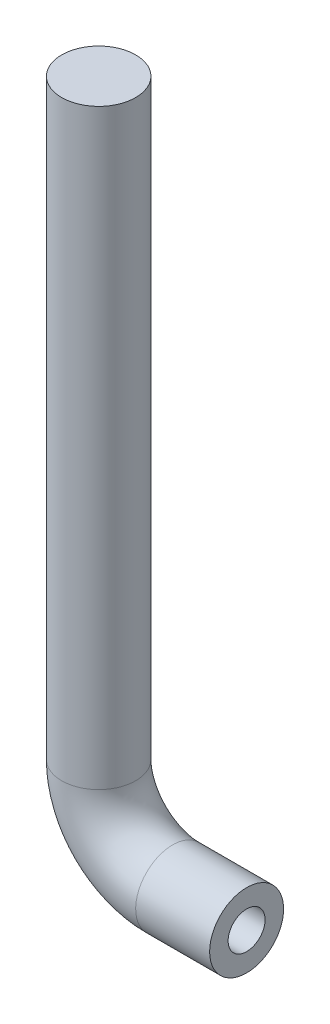
ISO-10303-21;
HEADER;
FILE_DESCRIPTION(('STEP AP214'),'2;1');
FILE_NAME('part.step','',(''),(''),'','','');
FILE_SCHEMA(('AUTOMOTIVE_DESIGN { 1 0 10303 214 1 1 1 1 }'));
ENDSEC;
DATA;
#1=APPLICATION_CONTEXT('core data for automotive mechanical design processes');
#2=APPLICATION_PROTOCOL_DEFINITION('international standard','automotive_design',2000,#1);
#3=PRODUCT_CONTEXT('',#1,'mechanical');
#4=PRODUCT('Part','Part','',(#3));
#5=PRODUCT_RELATED_PRODUCT_CATEGORY('part','',(#4));
#6=PRODUCT_DEFINITION_FORMATION('','',#4);
#7=PRODUCT_DEFINITION_CONTEXT('part definition',#1,'design');
#8=PRODUCT_DEFINITION('design','',#6,#7);
#9=PRODUCT_DEFINITION_SHAPE('','',#8);
#10=(LENGTH_UNIT() NAMED_UNIT(*) SI_UNIT(.MILLI.,.METRE.));
#11=(NAMED_UNIT(*) PLANE_ANGLE_UNIT() SI_UNIT($,.RADIAN.));
#12=(NAMED_UNIT(*) SI_UNIT($,.STERADIAN.) SOLID_ANGLE_UNIT());
#13=UNCERTAINTY_MEASURE_WITH_UNIT(LENGTH_MEASURE(1.E-05),#10,'distance_accuracy_value','');
#14=(GEOMETRIC_REPRESENTATION_CONTEXT(3) GLOBAL_UNCERTAINTY_ASSIGNED_CONTEXT((#13)) GLOBAL_UNIT_ASSIGNED_CONTEXT((#10,
#11,#12)) REPRESENTATION_CONTEXT('',''));
#15=CARTESIAN_POINT('',(0.,0.,0.));
#16=DIRECTION('',(0.,0.,1.));
#17=DIRECTION('',(1.,0.,0.));
#18=AXIS2_PLACEMENT_3D('',#15,#16,#17);
#19=CARTESIAN_POINT('',(0.,0.,0.));
#20=DIRECTION('',(0.,1.,0.));
#21=DIRECTION('',(0.,0.,1.));
#22=AXIS2_PLACEMENT_3D('',#19,#20,#21);
#23=PLANE('',#22);
#24=CARTESIAN_POINT('',(0.,0.,0.));
#25=DIRECTION('',(0.,1.,0.));
#26=DIRECTION('',(0.,0.,1.));
#27=AXIS2_PLACEMENT_3D('',#24,#25,#26);
#28=CIRCLE('',#27,6.35);
#29=CARTESIAN_POINT('',(0.,0.,6.35));
#30=VERTEX_POINT('',#29);
#31=EDGE_CURVE('E54',#30,#30,#28,.T.);
#32=ORIENTED_EDGE('',*,*,#31,.T.);
#33=EDGE_LOOP('',(#32));
#34=FACE_BOUND('',#33,.T.);
#35=ADVANCED_FACE('F37',(#34),#23,.T.);
#36=CARTESIAN_POINT('',(25.4,-114.3,0.));
#37=DIRECTION('',(-1.,0.,0.));
#38=DIRECTION('',(0.,0.,1.));
#39=AXIS2_PLACEMENT_3D('',#36,#37,#38);
#40=PLANE('',#39);
#41=CARTESIAN_POINT('',(25.4000000000003,-114.3,0.));
#42=DIRECTION('',(1.,0.,0.));
#43=DIRECTION('',(0.,1.,0.));
#44=AXIS2_PLACEMENT_3D('',#41,#42,#43);
#45=CIRCLE('',#44,3.175);
#46=CARTESIAN_POINT('',(25.4000000000003,-111.125,0.));
#47=VERTEX_POINT('',#46);
#48=EDGE_CURVE('E61',#47,#47,#45,.T.);
#49=ORIENTED_EDGE('',*,*,#48,.F.);
#50=EDGE_LOOP('',(#49));
#51=FACE_BOUND('',#50,.T.);
#52=CARTESIAN_POINT('',(25.4,-114.3,0.));
#53=DIRECTION('',(-1.,0.,0.));
#54=DIRECTION('',(0.,0.,1.));
#55=AXIS2_PLACEMENT_3D('',#52,#53,#54);
#56=CIRCLE('',#55,6.35);
#57=CARTESIAN_POINT('',(25.4,-114.3,6.35));
#58=VERTEX_POINT('',#57);
#59=EDGE_CURVE('E10',#58,#58,#56,.T.);
#60=ORIENTED_EDGE('',*,*,#59,.F.);
#61=EDGE_LOOP('',(#60));
#62=FACE_BOUND('',#61,.T.);
#63=ADVANCED_FACE('F78',(#51,#62),#40,.F.);
#64=CARTESIAN_POINT('',(0.,0.,0.));
#65=DIRECTION('',(0.,-1.,0.));
#66=DIRECTION('',(1.,0.,0.));
#67=AXIS2_PLACEMENT_3D('',#64,#65,#66);
#68=CYLINDRICAL_SURFACE('',#67,6.35);
#69=CARTESIAN_POINT('',(0.,-101.6,0.));
#70=DIRECTION('',(0.,1.,0.));
#71=DIRECTION('',(0.,0.,1.));
#72=AXIS2_PLACEMENT_3D('',#69,#70,#71);
#73=CIRCLE('',#72,6.35);
#74=CARTESIAN_POINT('',(-6.34999999999999,-101.6,0.));
#75=VERTEX_POINT('',#74);
#76=EDGE_CURVE('E49',#75,#75,#73,.T.);
#77=ORIENTED_EDGE('',*,*,#76,.T.);
#78=EDGE_LOOP('',(#77));
#79=FACE_BOUND('',#78,.T.);
#80=ORIENTED_EDGE('',*,*,#31,.F.);
#81=EDGE_LOOP('',(#80));
#82=FACE_BOUND('',#81,.T.);
#83=ADVANCED_FACE('F81',(#79,#82),#68,.T.);
#84=CARTESIAN_POINT('',(12.7,-101.6,0.));
#85=DIRECTION('',(0.,0.,1.));
#86=DIRECTION('',(1.,0.,0.));
#87=AXIS2_PLACEMENT_3D('',#84,#85,#86);
#88=TOROIDAL_SURFACE('',#87,12.7,6.35);
#89=CARTESIAN_POINT('',(12.7,-114.3,0.));
#90=DIRECTION('',(-1.,0.,0.));
#91=DIRECTION('',(0.,0.,1.));
#92=AXIS2_PLACEMENT_3D('',#89,#90,#91);
#93=CIRCLE('',#92,6.35);
#94=CARTESIAN_POINT('',(12.7,-120.65,0.));
#95=VERTEX_POINT('',#94);
#96=EDGE_CURVE('E44',#95,#95,#93,.T.);
#97=CARTESIAN_POINT('',(12.7,-101.6,0.));
#98=DIRECTION('',(0.,0.,1.));
#99=DIRECTION('',(1.,0.,0.));
#100=AXIS2_PLACEMENT_3D('',#97,#98,#99);
#101=CIRCLE('',#100,19.05);
#102=EDGE_CURVE('',#75,#95,#101,.T.);
#103=ORIENTED_EDGE('',*,*,#76,.F.);
#104=ORIENTED_EDGE('',*,*,#96,.T.);
#105=ORIENTED_EDGE('',*,*,#102,.T.);
#106=ORIENTED_EDGE('',*,*,#102,.F.);
#107=EDGE_LOOP('',(#103,#105,#104,#106));
#108=FACE_BOUND('',#107,.T.);
#109=ADVANCED_FACE('F86',(#108),#88,.T.);
#110=CARTESIAN_POINT('',(12.7,-114.3,0.));
#111=DIRECTION('',(1.,0.,0.));
#112=DIRECTION('',(0.,0.,-1.));
#113=AXIS2_PLACEMENT_3D('',#110,#111,#112);
#114=CYLINDRICAL_SURFACE('',#113,6.35);
#115=ORIENTED_EDGE('',*,*,#59,.T.);
#116=EDGE_LOOP('',(#115));
#117=FACE_BOUND('',#116,.T.);
#118=ORIENTED_EDGE('',*,*,#96,.F.);
#119=EDGE_LOOP('',(#118));
#120=FACE_BOUND('',#119,.T.);
#121=ADVANCED_FACE('F74',(#117,#120),#114,.T.);
#122=CARTESIAN_POINT('',(19.0500000000003,-114.3,0.));
#123=DIRECTION('',(1.,0.,0.));
#124=DIRECTION('',(0.,1.,0.));
#125=AXIS2_PLACEMENT_3D('',#122,#123,#124);
#126=CYLINDRICAL_SURFACE('',#125,3.175);
#127=CARTESIAN_POINT('',(19.0500000000003,-114.3,0.));
#128=DIRECTION('',(1.,0.,0.));
#129=DIRECTION('',(0.,1.,0.));
#130=AXIS2_PLACEMENT_3D('',#127,#128,#129);
#131=CIRCLE('',#130,3.175);
#132=CARTESIAN_POINT('',(19.0500000000003,-111.125,0.));
#133=VERTEX_POINT('',#132);
#134=EDGE_CURVE('E60',#133,#133,#131,.T.);
#135=ORIENTED_EDGE('',*,*,#134,.F.);
#136=EDGE_LOOP('',(#135));
#137=FACE_BOUND('',#136,.T.);
#138=ORIENTED_EDGE('',*,*,#48,.T.);
#139=EDGE_LOOP('',(#138));
#140=FACE_BOUND('',#139,.T.);
#141=ADVANCED_FACE('F71',(#137,#140),#126,.F.);
#142=CARTESIAN_POINT('',(19.0500000000003,-114.3,0.));
#143=DIRECTION('',(1.,0.,0.));
#144=DIRECTION('',(0.,1.,0.));
#145=AXIS2_PLACEMENT_3D('',#142,#143,#144);
#146=PLANE('',#145);
#147=ORIENTED_EDGE('',*,*,#134,.T.);
#148=EDGE_LOOP('',(#147));
#149=FACE_BOUND('',#148,.T.);
#150=ADVANCED_FACE('F69',(#149),#146,.T.);
#151=CLOSED_SHELL('',(#35,#63,#83,#109,#121,#141,#150));
#152=MANIFOLD_SOLID_BREP('B2',#151);
#153=ADVANCED_BREP_SHAPE_REPRESENTATION('',(#18,#152),#14);
#154=SHAPE_DEFINITION_REPRESENTATION(#9,#153);
ENDSEC;
END-ISO-10303-21;
